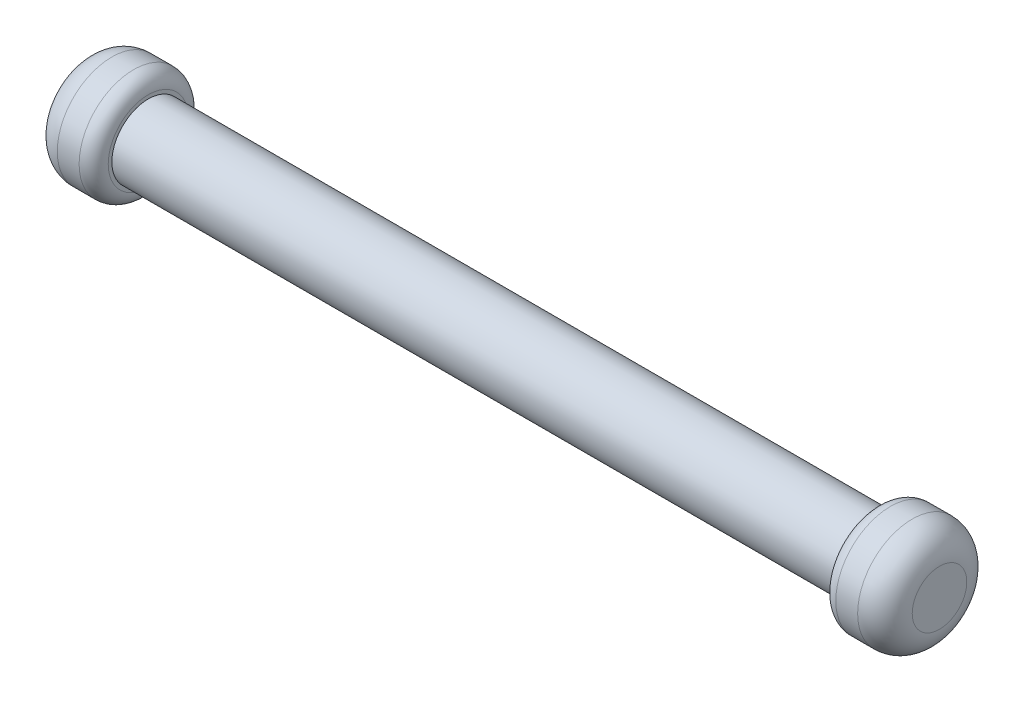
ISO-10303-21;
HEADER;
FILE_DESCRIPTION(('STEP AP214'),'2;1');
FILE_NAME('part.step','',(''),(''),'','','');
FILE_SCHEMA(('AUTOMOTIVE_DESIGN { 1 0 10303 214 1 1 1 1 }'));
ENDSEC;
DATA;
#1=APPLICATION_CONTEXT('core data for automotive mechanical design processes');
#2=APPLICATION_PROTOCOL_DEFINITION('international standard','automotive_design',2000,#1);
#3=PRODUCT_CONTEXT('',#1,'mechanical');
#4=PRODUCT('Part','Part','',(#3));
#5=PRODUCT_RELATED_PRODUCT_CATEGORY('part','',(#4));
#6=PRODUCT_DEFINITION_FORMATION('','',#4);
#7=PRODUCT_DEFINITION_CONTEXT('part definition',#1,'design');
#8=PRODUCT_DEFINITION('design','',#6,#7);
#9=PRODUCT_DEFINITION_SHAPE('','',#8);
#10=(LENGTH_UNIT() NAMED_UNIT(*) SI_UNIT(.MILLI.,.METRE.));
#11=(NAMED_UNIT(*) PLANE_ANGLE_UNIT() SI_UNIT($,.RADIAN.));
#12=(NAMED_UNIT(*) SI_UNIT($,.STERADIAN.) SOLID_ANGLE_UNIT());
#13=UNCERTAINTY_MEASURE_WITH_UNIT(LENGTH_MEASURE(1.E-05),#10,'distance_accuracy_value','');
#14=(GEOMETRIC_REPRESENTATION_CONTEXT(3) GLOBAL_UNCERTAINTY_ASSIGNED_CONTEXT((#13)) GLOBAL_UNIT_ASSIGNED_CONTEXT((#10,
#11,#12)) REPRESENTATION_CONTEXT('',''));
#15=CARTESIAN_POINT('',(0.,0.,0.));
#16=DIRECTION('',(0.,0.,1.));
#17=DIRECTION('',(1.,0.,0.));
#18=AXIS2_PLACEMENT_3D('',#15,#16,#17);
#19=CARTESIAN_POINT('',(0.,0.,0.));
#20=DIRECTION('',(-1.,0.,0.));
#21=DIRECTION('',(0.,0.,-1.));
#22=AXIS2_PLACEMENT_3D('',#19,#20,#21);
#23=PLANE('',#22);
#24=CARTESIAN_POINT('',(0.,0.,0.));
#25=DIRECTION('',(1.,0.,0.));
#26=DIRECTION('',(0.,0.,-1.));
#27=AXIS2_PLACEMENT_3D('',#24,#25,#26);
#28=CIRCLE('',#27,1.5);
#29=CARTESIAN_POINT('',(0.,0.,-1.5));
#30=VERTEX_POINT('',#29);
#31=EDGE_CURVE('E10',#30,#30,#28,.T.);
#32=ORIENTED_EDGE('',*,*,#31,.F.);
#33=EDGE_LOOP('',(#32));
#34=FACE_BOUND('',#33,.T.);
#35=ADVANCED_FACE('F35',(#34),#23,.T.);
#36=CARTESIAN_POINT('',(0.,0.,0.));
#37=DIRECTION('',(1.,0.,0.));
#38=DIRECTION('',(0.,0.,1.));
#39=AXIS2_PLACEMENT_3D('',#36,#37,#38);
#40=CYLINDRICAL_SURFACE('',#39,3.);
#41=CARTESIAN_POINT('',(1.5,0.,0.));
#42=DIRECTION('',(1.,0.,0.));
#43=DIRECTION('',(0.,0.,-1.));
#44=AXIS2_PLACEMENT_3D('',#41,#42,#43);
#45=CIRCLE('',#44,3.);
#46=CARTESIAN_POINT('',(1.5,0.,-3.));
#47=VERTEX_POINT('',#46);
#48=EDGE_CURVE('E42',#47,#47,#45,.F.);
#49=ORIENTED_EDGE('',*,*,#48,.F.);
#50=EDGE_LOOP('',(#49));
#51=FACE_BOUND('',#50,.T.);
#52=CARTESIAN_POINT('',(2.7,0.,0.));
#53=DIRECTION('',(-1.,0.,0.));
#54=DIRECTION('',(0.,0.,1.));
#55=AXIS2_PLACEMENT_3D('',#52,#53,#54);
#56=CIRCLE('',#55,3.);
#57=CARTESIAN_POINT('',(2.7,0.,3.));
#58=VERTEX_POINT('',#57);
#59=EDGE_CURVE('E55',#58,#58,#56,.F.);
#60=ORIENTED_EDGE('',*,*,#59,.F.);
#61=EDGE_LOOP('',(#60));
#62=FACE_BOUND('',#61,.T.);
#63=ADVANCED_FACE('F93',(#51,#62),#40,.T.);
#64=CARTESIAN_POINT('',(3.5,3.,0.));
#65=DIRECTION('',(1.,0.,0.));
#66=DIRECTION('',(0.,0.,1.));
#67=AXIS2_PLACEMENT_3D('',#64,#65,#66);
#68=PLANE('',#67);
#69=CARTESIAN_POINT('',(3.5,0.,0.));
#70=DIRECTION('',(-1.,0.,0.));
#71=DIRECTION('',(0.,0.,1.));
#72=AXIS2_PLACEMENT_3D('',#69,#70,#71);
#73=CIRCLE('',#72,2.2);
#74=CARTESIAN_POINT('',(3.5,0.,2.2));
#75=VERTEX_POINT('',#74);
#76=EDGE_CURVE('E58',#75,#75,#73,.T.);
#77=ORIENTED_EDGE('',*,*,#76,.F.);
#78=EDGE_LOOP('',(#77));
#79=FACE_BOUND('',#78,.T.);
#80=CARTESIAN_POINT('',(3.5,0.,0.));
#81=DIRECTION('',(-1.,0.,0.));
#82=DIRECTION('',(0.,0.,1.));
#83=AXIS2_PLACEMENT_3D('',#80,#81,#82);
#84=CIRCLE('',#83,2.);
#85=CARTESIAN_POINT('',(3.5,0.,2.));
#86=VERTEX_POINT('',#85);
#87=EDGE_CURVE('E67',#86,#86,#84,.T.);
#88=ORIENTED_EDGE('',*,*,#87,.T.);
#89=EDGE_LOOP('',(#88));
#90=FACE_BOUND('',#89,.T.);
#91=ADVANCED_FACE('F88',(#79,#90),#68,.T.);
#92=CARTESIAN_POINT('',(0.,0.,0.));
#93=DIRECTION('',(1.,0.,0.));
#94=DIRECTION('',(0.,0.,1.));
#95=AXIS2_PLACEMENT_3D('',#92,#93,#94);
#96=CYLINDRICAL_SURFACE('',#95,2.);
#97=ORIENTED_EDGE('',*,*,#87,.F.);
#98=EDGE_LOOP('',(#97));
#99=FACE_BOUND('',#98,.T.);
#100=CARTESIAN_POINT('',(43.5,0.,0.));
#101=DIRECTION('',(-1.,0.,0.));
#102=DIRECTION('',(0.,0.,1.));
#103=AXIS2_PLACEMENT_3D('',#100,#101,#102);
#104=CIRCLE('',#103,2.);
#105=CARTESIAN_POINT('',(43.5,0.,2.));
#106=VERTEX_POINT('',#105);
#107=EDGE_CURVE('E70',#106,#106,#104,.T.);
#108=ORIENTED_EDGE('',*,*,#107,.T.);
#109=EDGE_LOOP('',(#108));
#110=FACE_BOUND('',#109,.T.);
#111=ADVANCED_FACE('F74',(#99,#110),#96,.T.);
#112=CARTESIAN_POINT('',(43.5,2.,0.));
#113=DIRECTION('',(-1.,0.,0.));
#114=DIRECTION('',(0.,0.,-1.));
#115=AXIS2_PLACEMENT_3D('',#112,#113,#114);
#116=PLANE('',#115);
#117=CARTESIAN_POINT('',(43.5,0.,0.));
#118=DIRECTION('',(1.,0.,0.));
#119=DIRECTION('',(0.,0.,-1.));
#120=AXIS2_PLACEMENT_3D('',#117,#118,#119);
#121=CIRCLE('',#120,2.20000000000001);
#122=CARTESIAN_POINT('',(43.5,0.,-2.20000000000001));
#123=VERTEX_POINT('',#122);
#124=EDGE_CURVE('E61',#123,#123,#121,.T.);
#125=ORIENTED_EDGE('',*,*,#124,.F.);
#126=EDGE_LOOP('',(#125));
#127=FACE_BOUND('',#126,.T.);
#128=ORIENTED_EDGE('',*,*,#107,.F.);
#129=EDGE_LOOP('',(#128));
#130=FACE_BOUND('',#129,.T.);
#131=ADVANCED_FACE('F76',(#127,#130),#116,.T.);
#132=CARTESIAN_POINT('',(0.,0.,0.));
#133=DIRECTION('',(1.,0.,0.));
#134=DIRECTION('',(0.,0.,1.));
#135=AXIS2_PLACEMENT_3D('',#132,#133,#134);
#136=CYLINDRICAL_SURFACE('',#135,3.00000000000001);
#137=CARTESIAN_POINT('',(45.5,0.,0.));
#138=DIRECTION('',(-1.,0.,0.));
#139=DIRECTION('',(0.,0.,1.));
#140=AXIS2_PLACEMENT_3D('',#137,#138,#139);
#141=CIRCLE('',#140,3.00000000000001);
#142=CARTESIAN_POINT('',(45.5,0.,3.00000000000001));
#143=VERTEX_POINT('',#142);
#144=EDGE_CURVE('E46',#143,#143,#141,.F.);
#145=ORIENTED_EDGE('',*,*,#144,.F.);
#146=EDGE_LOOP('',(#145));
#147=FACE_BOUND('',#146,.T.);
#148=CARTESIAN_POINT('',(44.3,0.,0.));
#149=DIRECTION('',(1.,0.,0.));
#150=DIRECTION('',(0.,0.,-1.));
#151=AXIS2_PLACEMENT_3D('',#148,#149,#150);
#152=CIRCLE('',#151,3.00000000000001);
#153=CARTESIAN_POINT('',(44.3,0.,-3.00000000000001));
#154=VERTEX_POINT('',#153);
#155=EDGE_CURVE('E64',#154,#154,#152,.F.);
#156=ORIENTED_EDGE('',*,*,#155,.F.);
#157=EDGE_LOOP('',(#156));
#158=FACE_BOUND('',#157,.T.);
#159=ADVANCED_FACE('F78',(#147,#158),#136,.T.);
#160=CARTESIAN_POINT('',(47.,3.00000000000001,0.));
#161=DIRECTION('',(1.,0.,0.));
#162=DIRECTION('',(0.,0.,1.));
#163=AXIS2_PLACEMENT_3D('',#160,#161,#162);
#164=PLANE('',#163);
#165=CARTESIAN_POINT('',(47.,0.,0.));
#166=DIRECTION('',(-1.,0.,0.));
#167=DIRECTION('',(0.,0.,1.));
#168=AXIS2_PLACEMENT_3D('',#165,#166,#167);
#169=CIRCLE('',#168,1.50000000000001);
#170=CARTESIAN_POINT('',(47.,0.,1.50000000000001));
#171=VERTEX_POINT('',#170);
#172=EDGE_CURVE('E50',#171,#171,#169,.T.);
#173=ORIENTED_EDGE('',*,*,#172,.F.);
#174=EDGE_LOOP('',(#173));
#175=FACE_BOUND('',#174,.T.);
#176=ADVANCED_FACE('F85',(#175),#164,.T.);
#177=CARTESIAN_POINT('',(44.3,0.,0.));
#178=DIRECTION('',(-1.,0.,0.));
#179=DIRECTION('',(0.,0.,-1.));
#180=AXIS2_PLACEMENT_3D('',#177,#178,#179);
#181=TOROIDAL_SURFACE('',#180,2.20000000000001,0.8);
#182=ORIENTED_EDGE('',*,*,#124,.T.);
#183=EDGE_LOOP('',(#182));
#184=FACE_BOUND('',#183,.T.);
#185=ORIENTED_EDGE('',*,*,#155,.T.);
#186=EDGE_LOOP('',(#185));
#187=FACE_BOUND('',#186,.T.);
#188=ADVANCED_FACE('F103',(#184,#187),#181,.T.);
#189=CARTESIAN_POINT('',(2.7,0.,0.));
#190=DIRECTION('',(1.,0.,0.));
#191=DIRECTION('',(0.,0.,1.));
#192=AXIS2_PLACEMENT_3D('',#189,#190,#191);
#193=TOROIDAL_SURFACE('',#192,2.2,0.8);
#194=ORIENTED_EDGE('',*,*,#59,.T.);
#195=EDGE_LOOP('',(#194));
#196=FACE_BOUND('',#195,.T.);
#197=ORIENTED_EDGE('',*,*,#76,.T.);
#198=EDGE_LOOP('',(#197));
#199=FACE_BOUND('',#198,.T.);
#200=ADVANCED_FACE('F106',(#196,#199),#193,.T.);
#201=CARTESIAN_POINT('',(45.5,0.,0.));
#202=DIRECTION('',(1.,0.,0.));
#203=DIRECTION('',(0.,0.,1.));
#204=AXIS2_PLACEMENT_3D('',#201,#202,#203);
#205=TOROIDAL_SURFACE('',#204,1.50000000000001,1.5);
#206=ORIENTED_EDGE('',*,*,#144,.T.);
#207=EDGE_LOOP('',(#206));
#208=FACE_BOUND('',#207,.T.);
#209=ORIENTED_EDGE('',*,*,#172,.T.);
#210=EDGE_LOOP('',(#209));
#211=FACE_BOUND('',#210,.T.);
#212=ADVANCED_FACE('F109',(#208,#211),#205,.T.);
#213=CARTESIAN_POINT('',(1.5,0.,0.));
#214=DIRECTION('',(-1.,0.,0.));
#215=DIRECTION('',(0.,0.,-1.));
#216=AXIS2_PLACEMENT_3D('',#213,#214,#215);
#217=DEGENERATE_TOROIDAL_SURFACE('',#216,1.5,1.5,.T.);
#218=ORIENTED_EDGE('',*,*,#31,.T.);
#219=EDGE_LOOP('',(#218));
#220=FACE_BOUND('',#219,.T.);
#221=ORIENTED_EDGE('',*,*,#48,.T.);
#222=EDGE_LOOP('',(#221));
#223=FACE_BOUND('',#222,.T.);
#224=ADVANCED_FACE('F37',(#220,#223),#217,.T.);
#225=CLOSED_SHELL('',(#35,#63,#91,#111,#131,#159,#176,#188,#200,#212,#224));
#226=MANIFOLD_SOLID_BREP('B2',#225);
#227=ADVANCED_BREP_SHAPE_REPRESENTATION('',(#18,#226),#14);
#228=SHAPE_DEFINITION_REPRESENTATION(#9,#227);
ENDSEC;
END-ISO-10303-21;
